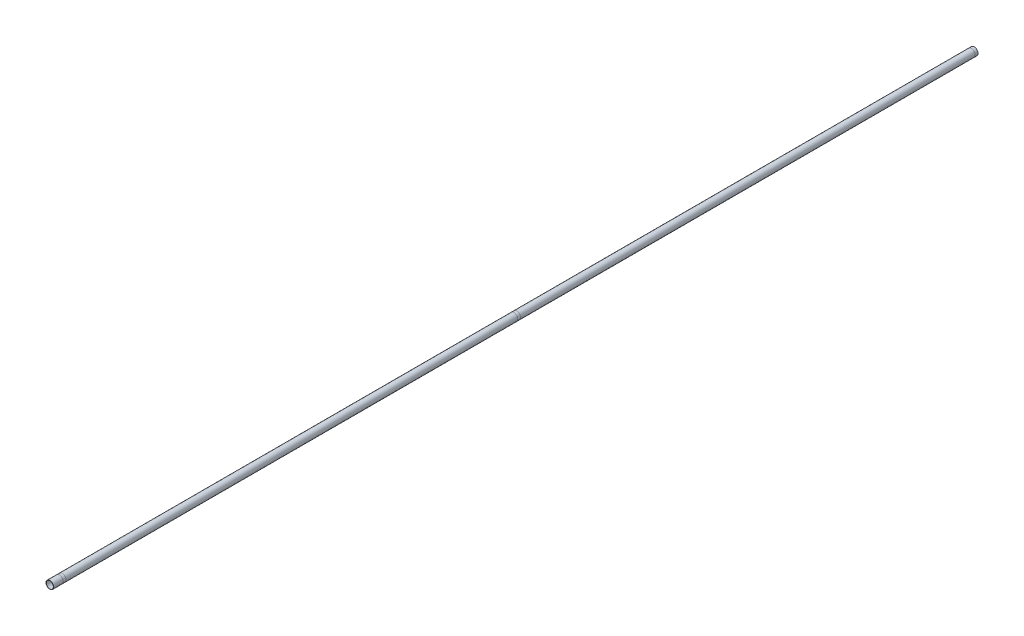
ISO-10303-21;
HEADER;
FILE_DESCRIPTION(('STEP AP214'),'2;1');
FILE_NAME('part.step','',(''),(''),'','','');
FILE_SCHEMA(('AUTOMOTIVE_DESIGN { 1 0 10303 214 1 1 1 1 }'));
ENDSEC;
DATA;
#1=APPLICATION_CONTEXT('core data for automotive mechanical design processes');
#2=APPLICATION_PROTOCOL_DEFINITION('international standard','automotive_design',2000,#1);
#3=PRODUCT_CONTEXT('',#1,'mechanical');
#4=PRODUCT('Part','Part','',(#3));
#5=PRODUCT_RELATED_PRODUCT_CATEGORY('part','',(#4));
#6=PRODUCT_DEFINITION_FORMATION('','',#4);
#7=PRODUCT_DEFINITION_CONTEXT('part definition',#1,'design');
#8=PRODUCT_DEFINITION('design','',#6,#7);
#9=PRODUCT_DEFINITION_SHAPE('','',#8);
#10=(LENGTH_UNIT() NAMED_UNIT(*) SI_UNIT(.MILLI.,.METRE.));
#11=(NAMED_UNIT(*) PLANE_ANGLE_UNIT() SI_UNIT($,.RADIAN.));
#12=(NAMED_UNIT(*) SI_UNIT($,.STERADIAN.) SOLID_ANGLE_UNIT());
#13=UNCERTAINTY_MEASURE_WITH_UNIT(LENGTH_MEASURE(1.E-05),#10,'distance_accuracy_value','');
#14=(GEOMETRIC_REPRESENTATION_CONTEXT(3) GLOBAL_UNCERTAINTY_ASSIGNED_CONTEXT((#13)) GLOBAL_UNIT_ASSIGNED_CONTEXT((#10,
#11,#12)) REPRESENTATION_CONTEXT('',''));
#15=CARTESIAN_POINT('',(0.,0.,0.));
#16=DIRECTION('',(0.,0.,1.));
#17=DIRECTION('',(1.,0.,0.));
#18=AXIS2_PLACEMENT_3D('',#15,#16,#17);
#19=CARTESIAN_POINT('',(0.,0.,19.05));
#20=DIRECTION('',(0.,0.,-1.));
#21=DIRECTION('',(-1.,0.,0.));
#22=AXIS2_PLACEMENT_3D('',#19,#20,#21);
#23=PLANE('',#22);
#24=CARTESIAN_POINT('',(0.,0.,19.05));
#25=DIRECTION('',(0.,0.,-1.));
#26=DIRECTION('',(-1.,0.,0.));
#27=AXIS2_PLACEMENT_3D('',#24,#25,#26);
#28=CIRCLE('',#27,25.4);
#29=CARTESIAN_POINT('',(-25.4,0.,19.05));
#30=VERTEX_POINT('',#29);
#31=EDGE_CURVE('E60',#30,#30,#28,.T.);
#32=ORIENTED_EDGE('',*,*,#31,.T.);
#33=EDGE_LOOP('',(#32));
#34=FACE_BOUND('',#33,.T.);
#35=CARTESIAN_POINT('',(0.,0.,19.05));
#36=DIRECTION('',(0.,0.,-1.));
#37=DIRECTION('',(-1.,0.,0.));
#38=AXIS2_PLACEMENT_3D('',#35,#36,#37);
#39=CIRCLE('',#38,23.495);
#40=CARTESIAN_POINT('',(-23.495,0.,19.05));
#41=VERTEX_POINT('',#40);
#42=EDGE_CURVE('E71',#41,#41,#39,.T.);
#43=ORIENTED_EDGE('',*,*,#42,.F.);
#44=EDGE_LOOP('',(#43));
#45=FACE_BOUND('',#44,.T.);
#46=ADVANCED_FACE('F56',(#34,#45),#23,.T.);
#47=CARTESIAN_POINT('',(0.,0.,6159.5));
#48=DIRECTION('',(0.,0.,-1.));
#49=DIRECTION('',(-1.,0.,0.));
#50=AXIS2_PLACEMENT_3D('',#47,#48,#49);
#51=CYLINDRICAL_SURFACE('',#50,23.495);
#52=CARTESIAN_POINT('',(0.,0.,3048.));
#53=DIRECTION('',(0.,0.,1.));
#54=DIRECTION('',(1.,0.,0.));
#55=AXIS2_PLACEMENT_3D('',#52,#53,#54);
#56=CIRCLE('',#55,23.495);
#57=CARTESIAN_POINT('',(23.495,0.,3048.));
#58=VERTEX_POINT('',#57);
#59=EDGE_CURVE('E65',#58,#58,#56,.T.);
#60=ORIENTED_EDGE('',*,*,#59,.T.);
#61=EDGE_LOOP('',(#60));
#62=FACE_BOUND('',#61,.T.);
#63=ORIENTED_EDGE('',*,*,#42,.T.);
#64=EDGE_LOOP('',(#63));
#65=FACE_BOUND('',#64,.T.);
#66=ADVANCED_FACE('F58',(#62,#65),#51,.F.);
#67=CARTESIAN_POINT('',(0.,0.,6159.5));
#68=DIRECTION('',(0.,0.,-1.));
#69=DIRECTION('',(-1.,0.,0.));
#70=AXIS2_PLACEMENT_3D('',#67,#68,#69);
#71=CYLINDRICAL_SURFACE('',#70,25.4);
#72=CARTESIAN_POINT('',(0.,0.,3048.));
#73=DIRECTION('',(0.,0.,1.));
#74=DIRECTION('',(1.,0.,0.));
#75=AXIS2_PLACEMENT_3D('',#72,#73,#74);
#76=CIRCLE('',#75,25.4);
#77=CARTESIAN_POINT('',(25.4,0.,3048.));
#78=VERTEX_POINT('',#77);
#79=EDGE_CURVE('E12',#78,#78,#76,.T.);
#80=ORIENTED_EDGE('',*,*,#79,.F.);
#81=EDGE_LOOP('',(#80));
#82=FACE_BOUND('',#81,.T.);
#83=ORIENTED_EDGE('',*,*,#31,.F.);
#84=EDGE_LOOP('',(#83));
#85=FACE_BOUND('',#84,.T.);
#86=ADVANCED_FACE('F83',(#82,#85),#71,.T.);
#87=CARTESIAN_POINT('',(0.,0.,3048.));
#88=DIRECTION('',(0.,0.,1.));
#89=DIRECTION('',(1.,0.,0.));
#90=AXIS2_PLACEMENT_3D('',#87,#88,#89);
#91=PLANE('',#90);
#92=ORIENTED_EDGE('',*,*,#79,.T.);
#93=EDGE_LOOP('',(#92));
#94=FACE_BOUND('',#93,.T.);
#95=ORIENTED_EDGE('',*,*,#59,.F.);
#96=EDGE_LOOP('',(#95));
#97=FACE_BOUND('',#96,.T.);
#98=ADVANCED_FACE('F85',(#94,#97),#91,.T.);
#99=CLOSED_SHELL('',(#46,#66,#86,#98));
#100=MANIFOLD_SOLID_BREP('B2',#99);
#101=CARTESIAN_POINT('',(0.,0.,19.05));
#102=DIRECTION('',(0.,0.,-1.));
#103=DIRECTION('',(-1.,0.,0.));
#104=AXIS2_PLACEMENT_3D('',#101,#102,#103);
#105=PLANE('',#104);
#106=CARTESIAN_POINT('',(0.,0.,19.05));
#107=DIRECTION('',(0.,0.,-1.));
#108=DIRECTION('',(-1.,0.,0.));
#109=AXIS2_PLACEMENT_3D('',#106,#107,#108);
#110=CIRCLE('',#109,23.495);
#111=CARTESIAN_POINT('',(-23.495,0.,19.05));
#112=VERTEX_POINT('',#111);
#113=EDGE_CURVE('E55',#112,#112,#110,.T.);
#114=ORIENTED_EDGE('',*,*,#113,.T.);
#115=EDGE_LOOP('',(#114));
#116=FACE_BOUND('',#115,.T.);
#117=CARTESIAN_POINT('',(0.,0.,19.05));
#118=DIRECTION('',(0.,0.,-1.));
#119=DIRECTION('',(-1.,0.,0.));
#120=AXIS2_PLACEMENT_3D('',#117,#118,#119);
#121=CIRCLE('',#120,25.4);
#122=CARTESIAN_POINT('',(-25.4,0.,19.05));
#123=VERTEX_POINT('',#122);
#124=EDGE_CURVE('E143',#123,#123,#121,.T.);
#125=ORIENTED_EDGE('',*,*,#124,.F.);
#126=EDGE_LOOP('',(#125));
#127=FACE_BOUND('',#126,.T.);
#128=ADVANCED_FACE('F137',(#116,#127),#105,.F.);
#129=CARTESIAN_POINT('',(0.,0.,0.));
#130=DIRECTION('',(0.,0.,1.));
#131=DIRECTION('',(1.,0.,0.));
#132=AXIS2_PLACEMENT_3D('',#129,#130,#131);
#133=PLANE('',#132);
#134=CARTESIAN_POINT('',(0.,0.,0.));
#135=DIRECTION('',(0.,0.,1.));
#136=DIRECTION('',(1.,0.,0.));
#137=AXIS2_PLACEMENT_3D('',#134,#135,#136);
#138=CIRCLE('',#137,25.4);
#139=CARTESIAN_POINT('',(25.4,0.,0.));
#140=VERTEX_POINT('',#139);
#141=EDGE_CURVE('E151',#140,#140,#138,.T.);
#142=ORIENTED_EDGE('',*,*,#141,.F.);
#143=EDGE_LOOP('',(#142));
#144=FACE_BOUND('',#143,.T.);
#145=CARTESIAN_POINT('',(0.,0.,0.));
#146=DIRECTION('',(0.,0.,1.));
#147=DIRECTION('',(1.,0.,0.));
#148=AXIS2_PLACEMENT_3D('',#145,#146,#147);
#149=CIRCLE('',#148,23.495);
#150=CARTESIAN_POINT('',(23.495,0.,0.));
#151=VERTEX_POINT('',#150);
#152=EDGE_CURVE('E147',#151,#151,#149,.T.);
#153=ORIENTED_EDGE('',*,*,#152,.T.);
#154=EDGE_LOOP('',(#153));
#155=FACE_BOUND('',#154,.T.);
#156=ADVANCED_FACE('F159',(#144,#155),#133,.F.);
#157=CARTESIAN_POINT('',(0.,0.,6159.5));
#158=DIRECTION('',(0.,0.,-1.));
#159=DIRECTION('',(-1.,0.,0.));
#160=AXIS2_PLACEMENT_3D('',#157,#158,#159);
#161=CYLINDRICAL_SURFACE('',#160,25.4);
#162=ORIENTED_EDGE('',*,*,#124,.T.);
#163=EDGE_LOOP('',(#162));
#164=FACE_BOUND('',#163,.T.);
#165=ORIENTED_EDGE('',*,*,#141,.T.);
#166=EDGE_LOOP('',(#165));
#167=FACE_BOUND('',#166,.T.);
#168=ADVANCED_FACE('F157',(#164,#167),#161,.T.);
#169=CARTESIAN_POINT('',(0.,0.,6159.5));
#170=DIRECTION('',(0.,0.,-1.));
#171=DIRECTION('',(-1.,0.,0.));
#172=AXIS2_PLACEMENT_3D('',#169,#170,#171);
#173=CYLINDRICAL_SURFACE('',#172,23.495);
#174=ORIENTED_EDGE('',*,*,#113,.F.);
#175=EDGE_LOOP('',(#174));
#176=FACE_BOUND('',#175,.T.);
#177=ORIENTED_EDGE('',*,*,#152,.F.);
#178=EDGE_LOOP('',(#177));
#179=FACE_BOUND('',#178,.T.);
#180=ADVANCED_FACE('F165',(#176,#179),#173,.F.);
#181=CLOSED_SHELL('',(#128,#156,#168,#180));
#182=MANIFOLD_SOLID_BREP('B7',#181);
#183=CARTESIAN_POINT('',(0.,0.,6096.));
#184=DIRECTION('',(0.,0.,1.));
#185=DIRECTION('',(1.,0.,0.));
#186=AXIS2_PLACEMENT_3D('',#183,#184,#185);
#187=PLANE('',#186);
#188=CARTESIAN_POINT('',(0.,0.,6096.));
#189=DIRECTION('',(0.,0.,1.));
#190=DIRECTION('',(1.,0.,0.));
#191=AXIS2_PLACEMENT_3D('',#188,#189,#190);
#192=CIRCLE('',#191,23.495);
#193=CARTESIAN_POINT('',(23.495,0.,6096.));
#194=VERTEX_POINT('',#193);
#195=EDGE_CURVE('E136',#194,#194,#192,.T.);
#196=ORIENTED_EDGE('',*,*,#195,.T.);
#197=EDGE_LOOP('',(#196));
#198=FACE_BOUND('',#197,.T.);
#199=CARTESIAN_POINT('',(0.,0.,6096.));
#200=DIRECTION('',(0.,0.,1.));
#201=DIRECTION('',(1.,0.,0.));
#202=AXIS2_PLACEMENT_3D('',#199,#200,#201);
#203=CIRCLE('',#202,25.4);
#204=CARTESIAN_POINT('',(25.4,0.,6096.));
#205=VERTEX_POINT('',#204);
#206=EDGE_CURVE('E219',#205,#205,#203,.T.);
#207=ORIENTED_EDGE('',*,*,#206,.F.);
#208=EDGE_LOOP('',(#207));
#209=FACE_BOUND('',#208,.T.);
#210=ADVANCED_FACE('F216',(#198,#209),#187,.F.);
#211=CARTESIAN_POINT('',(0.,0.,6159.5));
#212=DIRECTION('',(0.,0.,1.));
#213=DIRECTION('',(1.,0.,0.));
#214=AXIS2_PLACEMENT_3D('',#211,#212,#213);
#215=PLANE('',#214);
#216=CARTESIAN_POINT('',(0.,0.,6159.5));
#217=DIRECTION('',(0.,0.,1.));
#218=DIRECTION('',(1.,0.,0.));
#219=AXIS2_PLACEMENT_3D('',#216,#217,#218);
#220=CIRCLE('',#219,25.4);
#221=CARTESIAN_POINT('',(25.4,0.,6159.5));
#222=VERTEX_POINT('',#221);
#223=EDGE_CURVE('E226',#222,#222,#220,.T.);
#224=ORIENTED_EDGE('',*,*,#223,.T.);
#225=EDGE_LOOP('',(#224));
#226=FACE_BOUND('',#225,.T.);
#227=CARTESIAN_POINT('',(0.,0.,6159.5));
#228=DIRECTION('',(0.,0.,1.));
#229=DIRECTION('',(1.,0.,0.));
#230=AXIS2_PLACEMENT_3D('',#227,#228,#229);
#231=CIRCLE('',#230,23.495);
#232=CARTESIAN_POINT('',(23.495,0.,6159.5));
#233=VERTEX_POINT('',#232);
#234=EDGE_CURVE('E231',#233,#233,#231,.T.);
#235=ORIENTED_EDGE('',*,*,#234,.F.);
#236=EDGE_LOOP('',(#235));
#237=FACE_BOUND('',#236,.T.);
#238=ADVANCED_FACE('F237',(#226,#237),#215,.T.);
#239=CARTESIAN_POINT('',(0.,0.,6159.5));
#240=DIRECTION('',(0.,0.,-1.));
#241=DIRECTION('',(-1.,0.,0.));
#242=AXIS2_PLACEMENT_3D('',#239,#240,#241);
#243=CYLINDRICAL_SURFACE('',#242,23.495);
#244=ORIENTED_EDGE('',*,*,#195,.F.);
#245=EDGE_LOOP('',(#244));
#246=FACE_BOUND('',#245,.T.);
#247=ORIENTED_EDGE('',*,*,#234,.T.);
#248=EDGE_LOOP('',(#247));
#249=FACE_BOUND('',#248,.T.);
#250=ADVANCED_FACE('F235',(#246,#249),#243,.F.);
#251=CARTESIAN_POINT('',(0.,0.,6159.5));
#252=DIRECTION('',(0.,0.,-1.));
#253=DIRECTION('',(-1.,0.,0.));
#254=AXIS2_PLACEMENT_3D('',#251,#252,#253);
#255=CYLINDRICAL_SURFACE('',#254,25.4);
#256=ORIENTED_EDGE('',*,*,#206,.T.);
#257=EDGE_LOOP('',(#256));
#258=FACE_BOUND('',#257,.T.);
#259=ORIENTED_EDGE('',*,*,#223,.F.);
#260=EDGE_LOOP('',(#259));
#261=FACE_BOUND('',#260,.T.);
#262=ADVANCED_FACE('F245',(#258,#261),#255,.T.);
#263=CLOSED_SHELL('',(#210,#238,#250,#262));
#264=MANIFOLD_SOLID_BREP('B50',#263);
#265=CARTESIAN_POINT('',(0.,0.,6076.95));
#266=DIRECTION('',(0.,0.,-1.));
#267=DIRECTION('',(-1.,0.,0.));
#268=AXIS2_PLACEMENT_3D('',#265,#266,#267);
#269=PLANE('',#268);
#270=CARTESIAN_POINT('',(0.,0.,6076.95));
#271=DIRECTION('',(0.,0.,-1.));
#272=DIRECTION('',(-1.,0.,0.));
#273=AXIS2_PLACEMENT_3D('',#270,#271,#272);
#274=CIRCLE('',#273,25.4);
#275=CARTESIAN_POINT('',(-25.4,0.,6076.95));
#276=VERTEX_POINT('',#275);
#277=EDGE_CURVE('E300',#276,#276,#274,.T.);
#278=ORIENTED_EDGE('',*,*,#277,.T.);
#279=EDGE_LOOP('',(#278));
#280=FACE_BOUND('',#279,.T.);
#281=CARTESIAN_POINT('',(0.,0.,6076.95));
#282=DIRECTION('',(0.,0.,-1.));
#283=DIRECTION('',(-1.,0.,0.));
#284=AXIS2_PLACEMENT_3D('',#281,#282,#283);
#285=CIRCLE('',#284,23.495);
#286=CARTESIAN_POINT('',(-23.495,0.,6076.95));
#287=VERTEX_POINT('',#286);
#288=EDGE_CURVE('E309',#287,#287,#285,.T.);
#289=ORIENTED_EDGE('',*,*,#288,.F.);
#290=EDGE_LOOP('',(#289));
#291=FACE_BOUND('',#290,.T.);
#292=ADVANCED_FACE('F296',(#280,#291),#269,.T.);
#293=CARTESIAN_POINT('',(0.,0.,6096.));
#294=DIRECTION('',(0.,0.,1.));
#295=DIRECTION('',(1.,0.,0.));
#296=AXIS2_PLACEMENT_3D('',#293,#294,#295);
#297=PLANE('',#296);
#298=CARTESIAN_POINT('',(0.,0.,6096.));
#299=DIRECTION('',(0.,0.,1.));
#300=DIRECTION('',(1.,0.,0.));
#301=AXIS2_PLACEMENT_3D('',#298,#299,#300);
#302=CIRCLE('',#301,25.4);
#303=CARTESIAN_POINT('',(25.4,0.,6096.));
#304=VERTEX_POINT('',#303);
#305=EDGE_CURVE('E215',#304,#304,#302,.T.);
#306=ORIENTED_EDGE('',*,*,#305,.T.);
#307=EDGE_LOOP('',(#306));
#308=FACE_BOUND('',#307,.T.);
#309=CARTESIAN_POINT('',(0.,0.,6096.));
#310=DIRECTION('',(0.,0.,1.));
#311=DIRECTION('',(1.,0.,0.));
#312=AXIS2_PLACEMENT_3D('',#309,#310,#311);
#313=CIRCLE('',#312,23.495);
#314=CARTESIAN_POINT('',(23.495,0.,6096.));
#315=VERTEX_POINT('',#314);
#316=EDGE_CURVE('E304',#315,#315,#313,.T.);
#317=ORIENTED_EDGE('',*,*,#316,.F.);
#318=EDGE_LOOP('',(#317));
#319=FACE_BOUND('',#318,.T.);
#320=ADVANCED_FACE('F321',(#308,#319),#297,.T.);
#321=CARTESIAN_POINT('',(0.,0.,6159.5));
#322=DIRECTION('',(0.,0.,-1.));
#323=DIRECTION('',(-1.,0.,0.));
#324=AXIS2_PLACEMENT_3D('',#321,#322,#323);
#325=CYLINDRICAL_SURFACE('',#324,25.4);
#326=ORIENTED_EDGE('',*,*,#305,.F.);
#327=EDGE_LOOP('',(#326));
#328=FACE_BOUND('',#327,.T.);
#329=ORIENTED_EDGE('',*,*,#277,.F.);
#330=EDGE_LOOP('',(#329));
#331=FACE_BOUND('',#330,.T.);
#332=ADVANCED_FACE('F319',(#328,#331),#325,.T.);
#333=CARTESIAN_POINT('',(0.,0.,6159.5));
#334=DIRECTION('',(0.,0.,-1.));
#335=DIRECTION('',(-1.,0.,0.));
#336=AXIS2_PLACEMENT_3D('',#333,#334,#335);
#337=CYLINDRICAL_SURFACE('',#336,23.495);
#338=ORIENTED_EDGE('',*,*,#316,.T.);
#339=EDGE_LOOP('',(#338));
#340=FACE_BOUND('',#339,.T.);
#341=ORIENTED_EDGE('',*,*,#288,.T.);
#342=EDGE_LOOP('',(#341));
#343=FACE_BOUND('',#342,.T.);
#344=ADVANCED_FACE('F298',(#340,#343),#337,.F.);
#345=CLOSED_SHELL('',(#292,#320,#332,#344));
#346=MANIFOLD_SOLID_BREP('B131',#345);
#347=CARTESIAN_POINT('',(0.,0.,3067.05));
#348=DIRECTION('',(0.,0.,1.));
#349=DIRECTION('',(1.,0.,0.));
#350=AXIS2_PLACEMENT_3D('',#347,#348,#349);
#351=PLANE('',#350);
#352=CARTESIAN_POINT('',(0.,0.,3067.05));
#353=DIRECTION('',(0.,0.,1.));
#354=DIRECTION('',(1.,0.,0.));
#355=AXIS2_PLACEMENT_3D('',#352,#353,#354);
#356=CIRCLE('',#355,25.4);
#357=CARTESIAN_POINT('',(25.4,0.,3067.05));
#358=VERTEX_POINT('',#357);
#359=EDGE_CURVE('E377',#358,#358,#356,.T.);
#360=ORIENTED_EDGE('',*,*,#359,.T.);
#361=EDGE_LOOP('',(#360));
#362=FACE_BOUND('',#361,.T.);
#363=CARTESIAN_POINT('',(0.,0.,3067.05));
#364=DIRECTION('',(0.,0.,1.));
#365=DIRECTION('',(1.,0.,0.));
#366=AXIS2_PLACEMENT_3D('',#363,#364,#365);
#367=CIRCLE('',#366,23.495);
#368=CARTESIAN_POINT('',(23.495,0.,3067.05));
#369=VERTEX_POINT('',#368);
#370=EDGE_CURVE('E386',#369,#369,#367,.T.);
#371=ORIENTED_EDGE('',*,*,#370,.F.);
#372=EDGE_LOOP('',(#371));
#373=FACE_BOUND('',#372,.T.);
#374=ADVANCED_FACE('F373',(#362,#373),#351,.T.);
#375=CARTESIAN_POINT('',(0.,0.,3048.));
#376=DIRECTION('',(0.,0.,1.));
#377=DIRECTION('',(1.,0.,0.));
#378=AXIS2_PLACEMENT_3D('',#375,#376,#377);
#379=PLANE('',#378);
#380=CARTESIAN_POINT('',(0.,0.,3048.));
#381=DIRECTION('',(0.,0.,1.));
#382=DIRECTION('',(1.,0.,0.));
#383=AXIS2_PLACEMENT_3D('',#380,#381,#382);
#384=CIRCLE('',#383,23.495);
#385=CARTESIAN_POINT('',(23.495,0.,3048.));
#386=VERTEX_POINT('',#385);
#387=EDGE_CURVE('E295',#386,#386,#384,.T.);
#388=ORIENTED_EDGE('',*,*,#387,.T.);
#389=EDGE_LOOP('',(#388));
#390=FACE_BOUND('',#389,.T.);
#391=CARTESIAN_POINT('',(0.,0.,3048.));
#392=DIRECTION('',(0.,0.,1.));
#393=DIRECTION('',(1.,0.,0.));
#394=AXIS2_PLACEMENT_3D('',#391,#392,#393);
#395=CIRCLE('',#394,25.4);
#396=CARTESIAN_POINT('',(25.4,0.,3048.));
#397=VERTEX_POINT('',#396);
#398=EDGE_CURVE('E381',#397,#397,#395,.T.);
#399=ORIENTED_EDGE('',*,*,#398,.F.);
#400=EDGE_LOOP('',(#399));
#401=FACE_BOUND('',#400,.T.);
#402=ADVANCED_FACE('F398',(#390,#401),#379,.F.);
#403=CARTESIAN_POINT('',(0.,0.,6159.5));
#404=DIRECTION('',(0.,0.,-1.));
#405=DIRECTION('',(-1.,0.,0.));
#406=AXIS2_PLACEMENT_3D('',#403,#404,#405);
#407=CYLINDRICAL_SURFACE('',#406,25.4);
#408=ORIENTED_EDGE('',*,*,#398,.T.);
#409=EDGE_LOOP('',(#408));
#410=FACE_BOUND('',#409,.T.);
#411=ORIENTED_EDGE('',*,*,#359,.F.);
#412=EDGE_LOOP('',(#411));
#413=FACE_BOUND('',#412,.T.);
#414=ADVANCED_FACE('F396',(#410,#413),#407,.T.);
#415=CARTESIAN_POINT('',(0.,0.,6159.5));
#416=DIRECTION('',(0.,0.,-1.));
#417=DIRECTION('',(-1.,0.,0.));
#418=AXIS2_PLACEMENT_3D('',#415,#416,#417);
#419=CYLINDRICAL_SURFACE('',#418,23.495);
#420=ORIENTED_EDGE('',*,*,#387,.F.);
#421=EDGE_LOOP('',(#420));
#422=FACE_BOUND('',#421,.T.);
#423=ORIENTED_EDGE('',*,*,#370,.T.);
#424=EDGE_LOOP('',(#423));
#425=FACE_BOUND('',#424,.T.);
#426=ADVANCED_FACE('F375',(#422,#425),#419,.F.);
#427=CLOSED_SHELL('',(#374,#402,#414,#426));
#428=MANIFOLD_SOLID_BREP('B210',#427);
#429=CARTESIAN_POINT('',(0.,0.,6076.95));
#430=DIRECTION('',(0.,0.,-1.));
#431=DIRECTION('',(-1.,0.,0.));
#432=AXIS2_PLACEMENT_3D('',#429,#430,#431);
#433=PLANE('',#432);
#434=CARTESIAN_POINT('',(0.,0.,6076.95));
#435=DIRECTION('',(0.,0.,-1.));
#436=DIRECTION('',(-1.,0.,0.));
#437=AXIS2_PLACEMENT_3D('',#434,#435,#436);
#438=CIRCLE('',#437,23.495);
#439=CARTESIAN_POINT('',(-23.495,0.,6076.95));
#440=VERTEX_POINT('',#439);
#441=EDGE_CURVE('E446',#440,#440,#438,.T.);
#442=ORIENTED_EDGE('',*,*,#441,.T.);
#443=EDGE_LOOP('',(#442));
#444=FACE_BOUND('',#443,.T.);
#445=CARTESIAN_POINT('',(0.,0.,6076.95));
#446=DIRECTION('',(0.,0.,-1.));
#447=DIRECTION('',(-1.,0.,0.));
#448=AXIS2_PLACEMENT_3D('',#445,#446,#447);
#449=CIRCLE('',#448,25.4);
#450=CARTESIAN_POINT('',(-25.4,0.,6076.95));
#451=VERTEX_POINT('',#450);
#452=EDGE_CURVE('E455',#451,#451,#449,.T.);
#453=ORIENTED_EDGE('',*,*,#452,.F.);
#454=EDGE_LOOP('',(#453));
#455=FACE_BOUND('',#454,.T.);
#456=ADVANCED_FACE('F442',(#444,#455),#433,.F.);
#457=CARTESIAN_POINT('',(0.,0.,3067.05));
#458=DIRECTION('',(0.,0.,1.));
#459=DIRECTION('',(1.,0.,0.));
#460=AXIS2_PLACEMENT_3D('',#457,#458,#459);
#461=PLANE('',#460);
#462=CARTESIAN_POINT('',(0.,0.,3067.05));
#463=DIRECTION('',(0.,0.,1.));
#464=DIRECTION('',(1.,0.,0.));
#465=AXIS2_PLACEMENT_3D('',#462,#463,#464);
#466=CIRCLE('',#465,23.495);
#467=CARTESIAN_POINT('',(23.495,0.,3067.05));
#468=VERTEX_POINT('',#467);
#469=EDGE_CURVE('E372',#468,#468,#466,.T.);
#470=ORIENTED_EDGE('',*,*,#469,.T.);
#471=EDGE_LOOP('',(#470));
#472=FACE_BOUND('',#471,.T.);
#473=CARTESIAN_POINT('',(0.,0.,3067.05));
#474=DIRECTION('',(0.,0.,1.));
#475=DIRECTION('',(1.,0.,0.));
#476=AXIS2_PLACEMENT_3D('',#473,#474,#475);
#477=CIRCLE('',#476,25.4);
#478=CARTESIAN_POINT('',(25.4,0.,3067.05));
#479=VERTEX_POINT('',#478);
#480=EDGE_CURVE('E459',#479,#479,#477,.T.);
#481=ORIENTED_EDGE('',*,*,#480,.F.);
#482=EDGE_LOOP('',(#481));
#483=FACE_BOUND('',#482,.T.);
#484=ADVANCED_FACE('F444',(#472,#483),#461,.F.);
#485=CARTESIAN_POINT('',(0.,0.,6159.5));
#486=DIRECTION('',(0.,0.,-1.));
#487=DIRECTION('',(-1.,0.,0.));
#488=AXIS2_PLACEMENT_3D('',#485,#486,#487);
#489=CYLINDRICAL_SURFACE('',#488,25.4);
#490=ORIENTED_EDGE('',*,*,#452,.T.);
#491=EDGE_LOOP('',(#490));
#492=FACE_BOUND('',#491,.T.);
#493=ORIENTED_EDGE('',*,*,#480,.T.);
#494=EDGE_LOOP('',(#493));
#495=FACE_BOUND('',#494,.T.);
#496=ADVANCED_FACE('F463',(#492,#495),#489,.T.);
#497=CARTESIAN_POINT('',(0.,0.,6159.5));
#498=DIRECTION('',(0.,0.,-1.));
#499=DIRECTION('',(-1.,0.,0.));
#500=AXIS2_PLACEMENT_3D('',#497,#498,#499);
#501=CYLINDRICAL_SURFACE('',#500,23.495);
#502=ORIENTED_EDGE('',*,*,#441,.F.);
#503=EDGE_LOOP('',(#502));
#504=FACE_BOUND('',#503,.T.);
#505=ORIENTED_EDGE('',*,*,#469,.F.);
#506=EDGE_LOOP('',(#505));
#507=FACE_BOUND('',#506,.T.);
#508=ADVANCED_FACE('F470',(#504,#507),#501,.F.);
#509=CLOSED_SHELL('',(#456,#484,#496,#508));
#510=MANIFOLD_SOLID_BREP('B290',#509);
#511=ADVANCED_BREP_SHAPE_REPRESENTATION('',(#18,#100,#182,#264,#346,#428,#510),#14);
#512=SHAPE_DEFINITION_REPRESENTATION(#9,#511);
ENDSEC;
END-ISO-10303-21;
